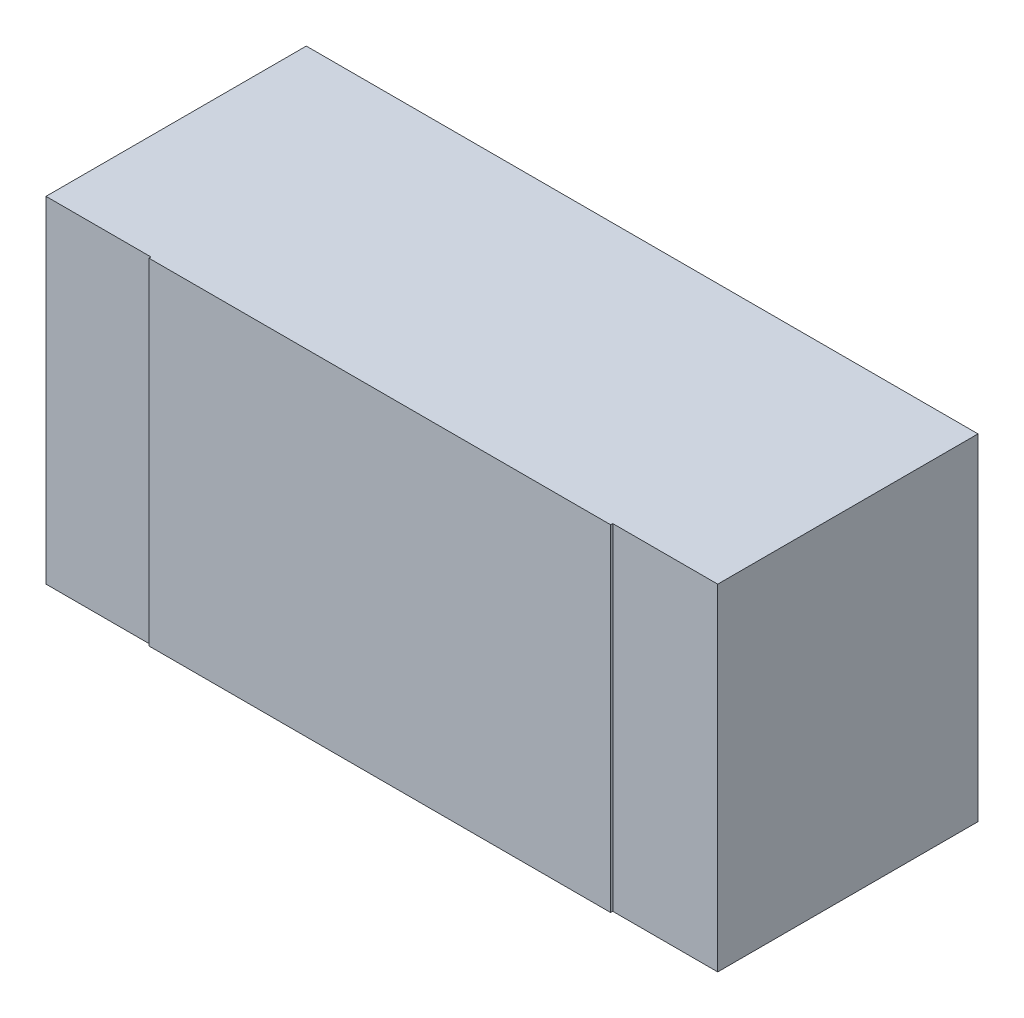
ISO-10303-21;
HEADER;
FILE_DESCRIPTION(('STEP AP214'),'2;1');
FILE_NAME('part.step','',(''),(''),'','','');
FILE_SCHEMA(('AUTOMOTIVE_DESIGN { 1 0 10303 214 1 1 1 1 }'));
ENDSEC;
DATA;
#1=APPLICATION_CONTEXT('core data for automotive mechanical design processes');
#2=APPLICATION_PROTOCOL_DEFINITION('international standard','automotive_design',2000,#1);
#3=PRODUCT_CONTEXT('',#1,'mechanical');
#4=PRODUCT('Part','Part','',(#3));
#5=PRODUCT_RELATED_PRODUCT_CATEGORY('part','',(#4));
#6=PRODUCT_DEFINITION_FORMATION('','',#4);
#7=PRODUCT_DEFINITION_CONTEXT('part definition',#1,'design');
#8=PRODUCT_DEFINITION('design','',#6,#7);
#9=PRODUCT_DEFINITION_SHAPE('','',#8);
#10=(LENGTH_UNIT() NAMED_UNIT(*) SI_UNIT(.MILLI.,.METRE.));
#11=(NAMED_UNIT(*) PLANE_ANGLE_UNIT() SI_UNIT($,.RADIAN.));
#12=(NAMED_UNIT(*) SI_UNIT($,.STERADIAN.) SOLID_ANGLE_UNIT());
#13=UNCERTAINTY_MEASURE_WITH_UNIT(LENGTH_MEASURE(1.E-05),#10,'distance_accuracy_value','');
#14=(GEOMETRIC_REPRESENTATION_CONTEXT(3) GLOBAL_UNCERTAINTY_ASSIGNED_CONTEXT((#13)) GLOBAL_UNIT_ASSIGNED_CONTEXT((#10,
#11,#12)) REPRESENTATION_CONTEXT('',''));
#15=CARTESIAN_POINT('',(0.,0.,0.));
#16=DIRECTION('',(0.,0.,1.));
#17=DIRECTION('',(1.,0.,0.));
#18=AXIS2_PLACEMENT_3D('',#15,#16,#17);
#19=CARTESIAN_POINT('',(2.9,0.8,1.25));
#20=DIRECTION('',(-1.,0.,0.));
#21=DIRECTION('',(0.,0.,1.));
#22=AXIS2_PLACEMENT_3D('',#19,#20,#21);
#23=PLANE('',#22);
#24=DIRECTION('',(0.,1.,0.));
#25=VECTOR('',#24,1.);
#26=CARTESIAN_POINT('',(2.9,0.8,1.24));
#27=LINE('',#26,#25);
#28=CARTESIAN_POINT('',(2.9,-0.8,1.24));
#29=VERTEX_POINT('',#28);
#30=CARTESIAN_POINT('',(2.9,0.8,1.24));
#31=VERTEX_POINT('',#30);
#32=EDGE_CURVE('E131',#29,#31,#27,.T.);
#33=ORIENTED_EDGE('',*,*,#32,.F.);
#34=DIRECTION('',(0.,0.,-1.));
#35=VECTOR('',#34,1.);
#36=CARTESIAN_POINT('',(2.9,-0.8,1.25));
#37=LINE('',#36,#35);
#38=CARTESIAN_POINT('',(2.9,-0.8,0.));
#39=VERTEX_POINT('',#38);
#40=EDGE_CURVE('E37',#29,#39,#37,.T.);
#41=ORIENTED_EDGE('',*,*,#40,.T.);
#42=DIRECTION('',(0.,1.,0.));
#43=VECTOR('',#42,1.);
#44=CARTESIAN_POINT('',(2.9,0.8,0.));
#45=LINE('',#44,#43);
#46=CARTESIAN_POINT('',(2.9,0.8,0.));
#47=VERTEX_POINT('',#46);
#48=EDGE_CURVE('E118',#39,#47,#45,.T.);
#49=ORIENTED_EDGE('',*,*,#48,.T.);
#50=DIRECTION('',(0.,0.,-1.));
#51=VECTOR('',#50,1.);
#52=CARTESIAN_POINT('',(2.9,0.8,1.25));
#53=LINE('',#52,#51);
#54=EDGE_CURVE('E123',#31,#47,#53,.T.);
#55=ORIENTED_EDGE('',*,*,#54,.F.);
#56=EDGE_LOOP('',(#33,#41,#49,#55));
#57=FACE_BOUND('',#56,.T.);
#58=ADVANCED_FACE('F29',(#57),#23,.F.);
#59=CARTESIAN_POINT('',(-0.300000000000001,0.799999999999999,1.25));
#60=DIRECTION('',(1.,0.,0.));
#61=DIRECTION('',(0.,1.,0.));
#62=AXIS2_PLACEMENT_3D('',#59,#60,#61);
#63=PLANE('',#62);
#64=DIRECTION('',(0.,-1.,0.));
#65=VECTOR('',#64,1.);
#66=CARTESIAN_POINT('',(-0.300000000000001,0.799999999999999,1.24));
#67=LINE('',#66,#65);
#68=CARTESIAN_POINT('',(-0.300000000000001,0.799999999999999,1.24));
#69=VERTEX_POINT('',#68);
#70=CARTESIAN_POINT('',(-0.300000000000001,-0.8,1.24));
#71=VERTEX_POINT('',#70);
#72=EDGE_CURVE('E156',#69,#71,#67,.T.);
#73=ORIENTED_EDGE('',*,*,#72,.F.);
#74=DIRECTION('',(0.,0.,-1.));
#75=VECTOR('',#74,1.);
#76=CARTESIAN_POINT('',(-0.300000000000001,0.799999999999999,1.25));
#77=LINE('',#76,#75);
#78=CARTESIAN_POINT('',(-0.300000000000001,0.799999999999999,0.));
#79=VERTEX_POINT('',#78);
#80=EDGE_CURVE('E115',#69,#79,#77,.T.);
#81=ORIENTED_EDGE('',*,*,#80,.T.);
#82=DIRECTION('',(0.,-1.,0.));
#83=VECTOR('',#82,1.);
#84=CARTESIAN_POINT('',(-0.300000000000001,0.799999999999999,0.));
#85=LINE('',#84,#83);
#86=CARTESIAN_POINT('',(-0.3,-0.8,0.));
#87=VERTEX_POINT('',#86);
#88=EDGE_CURVE('E139',#79,#87,#85,.T.);
#89=ORIENTED_EDGE('',*,*,#88,.T.);
#90=DIRECTION('',(0.,0.,-1.));
#91=VECTOR('',#90,1.);
#92=CARTESIAN_POINT('',(-0.3,-0.8,1.25));
#93=LINE('',#92,#91);
#94=EDGE_CURVE('E11',#71,#87,#93,.T.);
#95=ORIENTED_EDGE('',*,*,#94,.F.);
#96=EDGE_LOOP('',(#73,#81,#89,#95));
#97=FACE_BOUND('',#96,.T.);
#98=ADVANCED_FACE('F31',(#97),#63,.F.);
#99=CARTESIAN_POINT('',(-0.3,-0.8,1.25));
#100=DIRECTION('',(0.,1.,0.));
#101=DIRECTION('',(-1.,0.,0.));
#102=AXIS2_PLACEMENT_3D('',#99,#100,#101);
#103=PLANE('',#102);
#104=DIRECTION('',(1.,0.,0.));
#105=VECTOR('',#104,1.);
#106=CARTESIAN_POINT('',(2.4,-0.8,1.24));
#107=LINE('',#106,#105);
#108=CARTESIAN_POINT('',(2.4,-0.8,1.24));
#109=VERTEX_POINT('',#108);
#110=EDGE_CURVE('E107',#109,#29,#107,.T.);
#111=ORIENTED_EDGE('',*,*,#110,.F.);
#112=DIRECTION('',(0.,0.,1.));
#113=VECTOR('',#112,1.);
#114=CARTESIAN_POINT('',(2.4,-0.8,1.24));
#115=LINE('',#114,#113);
#116=CARTESIAN_POINT('',(2.4,-0.8,1.25));
#117=VERTEX_POINT('',#116);
#118=EDGE_CURVE('E94',#109,#117,#115,.T.);
#119=ORIENTED_EDGE('',*,*,#118,.T.);
#120=DIRECTION('',(1.,0.,0.));
#121=VECTOR('',#120,1.);
#122=CARTESIAN_POINT('',(-0.3,-0.8,1.25));
#123=LINE('',#122,#121);
#124=CARTESIAN_POINT('',(0.199999999999999,-0.8,1.25));
#125=VERTEX_POINT('',#124);
#126=EDGE_CURVE('E105',#125,#117,#123,.T.);
#127=ORIENTED_EDGE('',*,*,#126,.F.);
#128=DIRECTION('',(0.,0.,1.));
#129=VECTOR('',#128,1.);
#130=CARTESIAN_POINT('',(0.199999999999999,-0.8,1.24));
#131=LINE('',#130,#129);
#132=CARTESIAN_POINT('',(0.199999999999999,-0.8,1.24));
#133=VERTEX_POINT('',#132);
#134=EDGE_CURVE('E52',#133,#125,#131,.T.);
#135=ORIENTED_EDGE('',*,*,#134,.F.);
#136=DIRECTION('',(1.,0.,0.));
#137=VECTOR('',#136,1.);
#138=CARTESIAN_POINT('',(-0.300000000000001,-0.8,1.24));
#139=LINE('',#138,#137);
#140=EDGE_CURVE('E153',#71,#133,#139,.T.);
#141=ORIENTED_EDGE('',*,*,#140,.F.);
#142=ORIENTED_EDGE('',*,*,#94,.T.);
#143=DIRECTION('',(1.,0.,0.));
#144=VECTOR('',#143,1.);
#145=CARTESIAN_POINT('',(-0.3,-0.8,0.));
#146=LINE('',#145,#144);
#147=EDGE_CURVE('E133',#87,#39,#146,.T.);
#148=ORIENTED_EDGE('',*,*,#147,.T.);
#149=ORIENTED_EDGE('',*,*,#40,.F.);
#150=EDGE_LOOP('',(#111,#119,#127,#135,#141,#142,#148,#149));
#151=FACE_BOUND('',#150,.T.);
#152=ADVANCED_FACE('F104',(#151),#103,.F.);
#153=CARTESIAN_POINT('',(-0.300000000000001,0.799999999999999,1.25));
#154=DIRECTION('',(0.,-1.,0.));
#155=DIRECTION('',(1.,0.,0.));
#156=AXIS2_PLACEMENT_3D('',#153,#154,#155);
#157=PLANE('',#156);
#158=DIRECTION('',(-1.,0.,0.));
#159=VECTOR('',#158,1.);
#160=CARTESIAN_POINT('',(-0.300000000000001,0.799999999999999,1.25));
#161=LINE('',#160,#159);
#162=CARTESIAN_POINT('',(2.4,0.799999999999999,1.25));
#163=VERTEX_POINT('',#162);
#164=CARTESIAN_POINT('',(0.199999999999999,0.8,1.25));
#165=VERTEX_POINT('',#164);
#166=EDGE_CURVE('E112',#163,#165,#161,.T.);
#167=ORIENTED_EDGE('',*,*,#166,.F.);
#168=DIRECTION('',(0.,0.,1.));
#169=VECTOR('',#168,1.);
#170=CARTESIAN_POINT('',(2.4,0.8,1.24));
#171=LINE('',#170,#169);
#172=CARTESIAN_POINT('',(2.4,0.8,1.24));
#173=VERTEX_POINT('',#172);
#174=EDGE_CURVE('E44',#173,#163,#171,.T.);
#175=ORIENTED_EDGE('',*,*,#174,.F.);
#176=DIRECTION('',(-1.,0.,0.));
#177=VECTOR('',#176,1.);
#178=CARTESIAN_POINT('',(2.4,0.8,1.24));
#179=LINE('',#178,#177);
#180=EDGE_CURVE('E108',#31,#173,#179,.T.);
#181=ORIENTED_EDGE('',*,*,#180,.F.);
#182=ORIENTED_EDGE('',*,*,#54,.T.);
#183=DIRECTION('',(-1.,0.,0.));
#184=VECTOR('',#183,1.);
#185=CARTESIAN_POINT('',(-0.300000000000001,0.799999999999999,0.));
#186=LINE('',#185,#184);
#187=EDGE_CURVE('E113',#47,#79,#186,.T.);
#188=ORIENTED_EDGE('',*,*,#187,.T.);
#189=ORIENTED_EDGE('',*,*,#80,.F.);
#190=DIRECTION('',(-1.,0.,0.));
#191=VECTOR('',#190,1.);
#192=CARTESIAN_POINT('',(-0.300000000000001,0.799999999999999,1.24));
#193=LINE('',#192,#191);
#194=CARTESIAN_POINT('',(0.199999999999999,0.8,1.24));
#195=VERTEX_POINT('',#194);
#196=EDGE_CURVE('E146',#195,#69,#193,.T.);
#197=ORIENTED_EDGE('',*,*,#196,.F.);
#198=DIRECTION('',(0.,0.,1.));
#199=VECTOR('',#198,1.);
#200=CARTESIAN_POINT('',(0.199999999999999,0.8,1.24));
#201=LINE('',#200,#199);
#202=EDGE_CURVE('E144',#195,#165,#201,.T.);
#203=ORIENTED_EDGE('',*,*,#202,.T.);
#204=EDGE_LOOP('',(#167,#175,#181,#182,#188,#189,#197,#203));
#205=FACE_BOUND('',#204,.T.);
#206=ADVANCED_FACE('F168',(#205),#157,.F.);
#207=CARTESIAN_POINT('',(-0.3,-0.8,1.25));
#208=DIRECTION('',(0.,0.,1.));
#209=DIRECTION('',(1.,0.,0.));
#210=AXIS2_PLACEMENT_3D('',#207,#208,#209);
#211=PLANE('',#210);
#212=DIRECTION('',(0.,-1.,0.));
#213=VECTOR('',#212,1.);
#214=CARTESIAN_POINT('',(2.4,0.8,1.25));
#215=LINE('',#214,#213);
#216=EDGE_CURVE('E91',#163,#117,#215,.T.);
#217=ORIENTED_EDGE('',*,*,#216,.F.);
#218=ORIENTED_EDGE('',*,*,#166,.T.);
#219=DIRECTION('',(0.,1.,0.));
#220=VECTOR('',#219,1.);
#221=CARTESIAN_POINT('',(0.199999999999999,0.8,1.25));
#222=LINE('',#221,#220);
#223=EDGE_CURVE('E111',#125,#165,#222,.T.);
#224=ORIENTED_EDGE('',*,*,#223,.F.);
#225=ORIENTED_EDGE('',*,*,#126,.T.);
#226=EDGE_LOOP('',(#217,#218,#224,#225));
#227=FACE_BOUND('',#226,.T.);
#228=ADVANCED_FACE('F110',(#227),#211,.T.);
#229=CARTESIAN_POINT('',(-0.3,-0.8,0.));
#230=DIRECTION('',(0.,0.,1.));
#231=DIRECTION('',(1.,0.,0.));
#232=AXIS2_PLACEMENT_3D('',#229,#230,#231);
#233=PLANE('',#232);
#234=ORIENTED_EDGE('',*,*,#88,.F.);
#235=ORIENTED_EDGE('',*,*,#187,.F.);
#236=ORIENTED_EDGE('',*,*,#48,.F.);
#237=ORIENTED_EDGE('',*,*,#147,.F.);
#238=EDGE_LOOP('',(#234,#235,#236,#237));
#239=FACE_BOUND('',#238,.T.);
#240=ADVANCED_FACE('F141',(#239),#233,.F.);
#241=CARTESIAN_POINT('',(0.199999999999999,0.8,1.24));
#242=DIRECTION('',(1.,0.,0.));
#243=DIRECTION('',(0.,1.,0.));
#244=AXIS2_PLACEMENT_3D('',#241,#242,#243);
#245=PLANE('',#244);
#246=ORIENTED_EDGE('',*,*,#223,.T.);
#247=ORIENTED_EDGE('',*,*,#202,.F.);
#248=DIRECTION('',(0.,1.,0.));
#249=VECTOR('',#248,1.);
#250=CARTESIAN_POINT('',(0.199999999999999,0.8,1.24));
#251=LINE('',#250,#249);
#252=EDGE_CURVE('E150',#133,#195,#251,.T.);
#253=ORIENTED_EDGE('',*,*,#252,.F.);
#254=ORIENTED_EDGE('',*,*,#134,.T.);
#255=EDGE_LOOP('',(#246,#247,#253,#254));
#256=FACE_BOUND('',#255,.T.);
#257=ADVANCED_FACE('F170',(#256),#245,.F.);
#258=CARTESIAN_POINT('',(-0.300000000000001,-0.8,1.24));
#259=DIRECTION('',(0.,0.,1.));
#260=DIRECTION('',(1.,0.,0.));
#261=AXIS2_PLACEMENT_3D('',#258,#259,#260);
#262=PLANE('',#261);
#263=ORIENTED_EDGE('',*,*,#72,.T.);
#264=ORIENTED_EDGE('',*,*,#140,.T.);
#265=ORIENTED_EDGE('',*,*,#252,.T.);
#266=ORIENTED_EDGE('',*,*,#196,.T.);
#267=EDGE_LOOP('',(#263,#264,#265,#266));
#268=FACE_BOUND('',#267,.T.);
#269=ADVANCED_FACE('F172',(#268),#262,.T.);
#270=CARTESIAN_POINT('',(2.4,0.8,1.24));
#271=DIRECTION('',(-1.,0.,0.));
#272=DIRECTION('',(0.,-1.,0.));
#273=AXIS2_PLACEMENT_3D('',#270,#271,#272);
#274=PLANE('',#273);
#275=ORIENTED_EDGE('',*,*,#216,.T.);
#276=ORIENTED_EDGE('',*,*,#118,.F.);
#277=DIRECTION('',(0.,-1.,0.));
#278=VECTOR('',#277,1.);
#279=CARTESIAN_POINT('',(2.4,0.8,1.24));
#280=LINE('',#279,#278);
#281=EDGE_CURVE('E99',#173,#109,#280,.T.);
#282=ORIENTED_EDGE('',*,*,#281,.F.);
#283=ORIENTED_EDGE('',*,*,#174,.T.);
#284=EDGE_LOOP('',(#275,#276,#282,#283));
#285=FACE_BOUND('',#284,.T.);
#286=ADVANCED_FACE('F93',(#285),#274,.F.);
#287=CARTESIAN_POINT('',(2.4,-0.8,1.24));
#288=DIRECTION('',(0.,0.,1.));
#289=DIRECTION('',(1.,0.,0.));
#290=AXIS2_PLACEMENT_3D('',#287,#288,#289);
#291=PLANE('',#290);
#292=ORIENTED_EDGE('',*,*,#281,.T.);
#293=ORIENTED_EDGE('',*,*,#110,.T.);
#294=ORIENTED_EDGE('',*,*,#32,.T.);
#295=ORIENTED_EDGE('',*,*,#180,.T.);
#296=EDGE_LOOP('',(#292,#293,#294,#295));
#297=FACE_BOUND('',#296,.T.);
#298=ADVANCED_FACE('F165',(#297),#291,.T.);
#299=CLOSED_SHELL('',(#58,#98,#152,#206,#228,#240,#257,#269,#286,#298));
#300=MANIFOLD_SOLID_BREP('B2',#299);
#301=ADVANCED_BREP_SHAPE_REPRESENTATION('',(#18,#300),#14);
#302=SHAPE_DEFINITION_REPRESENTATION(#9,#301);
ENDSEC;
END-ISO-10303-21;
